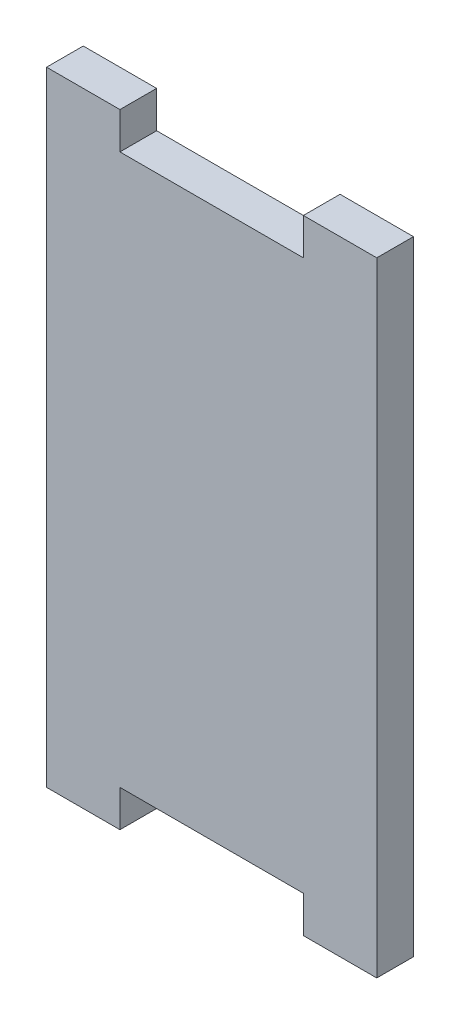
ISO-10303-21;
HEADER;
FILE_DESCRIPTION(('STEP AP214'),'2;1');
FILE_NAME('part.step','',(''),(''),'','','');
FILE_SCHEMA(('AUTOMOTIVE_DESIGN { 1 0 10303 214 1 1 1 1 }'));
ENDSEC;
DATA;
#1=APPLICATION_CONTEXT('core data for automotive mechanical design processes');
#2=APPLICATION_PROTOCOL_DEFINITION('international standard','automotive_design',2000,#1);
#3=PRODUCT_CONTEXT('',#1,'mechanical');
#4=PRODUCT('Part','Part','',(#3));
#5=PRODUCT_RELATED_PRODUCT_CATEGORY('part','',(#4));
#6=PRODUCT_DEFINITION_FORMATION('','',#4);
#7=PRODUCT_DEFINITION_CONTEXT('part definition',#1,'design');
#8=PRODUCT_DEFINITION('design','',#6,#7);
#9=PRODUCT_DEFINITION_SHAPE('','',#8);
#10=(LENGTH_UNIT() NAMED_UNIT(*) SI_UNIT(.MILLI.,.METRE.));
#11=(NAMED_UNIT(*) PLANE_ANGLE_UNIT() SI_UNIT($,.RADIAN.));
#12=(NAMED_UNIT(*) SI_UNIT($,.STERADIAN.) SOLID_ANGLE_UNIT());
#13=UNCERTAINTY_MEASURE_WITH_UNIT(LENGTH_MEASURE(1.E-05),#10,'distance_accuracy_value','');
#14=(GEOMETRIC_REPRESENTATION_CONTEXT(3) GLOBAL_UNCERTAINTY_ASSIGNED_CONTEXT((#13)) GLOBAL_UNIT_ASSIGNED_CONTEXT((#10,
#11,#12)) REPRESENTATION_CONTEXT('',''));
#15=CARTESIAN_POINT('',(0.,0.,0.));
#16=DIRECTION('',(0.,0.,1.));
#17=DIRECTION('',(1.,0.,0.));
#18=AXIS2_PLACEMENT_3D('',#15,#16,#17);
#19=CARTESIAN_POINT('',(0.,0.,5.));
#20=DIRECTION('',(0.,1.,0.));
#21=DIRECTION('',(0.,0.,1.));
#22=AXIS2_PLACEMENT_3D('',#19,#20,#21);
#23=PLANE('',#22);
#24=DIRECTION('',(1.,0.,0.));
#25=VECTOR('',#24,1.);
#26=CARTESIAN_POINT('',(0.,0.,0.));
#27=LINE('',#26,#25);
#28=CARTESIAN_POINT('',(9.99999999999999,0.,0.));
#29=VERTEX_POINT('',#28);
#30=CARTESIAN_POINT('',(35.,0.,0.));
#31=VERTEX_POINT('',#30);
#32=EDGE_CURVE('E55',#29,#31,#27,.T.);
#33=ORIENTED_EDGE('',*,*,#32,.T.);
#34=DIRECTION('',(0.,0.,1.));
#35=VECTOR('',#34,1.);
#36=CARTESIAN_POINT('',(35.,0.,0.));
#37=LINE('',#36,#35);
#38=CARTESIAN_POINT('',(35.,0.,5.));
#39=VERTEX_POINT('',#38);
#40=EDGE_CURVE('E50',#31,#39,#37,.T.);
#41=ORIENTED_EDGE('',*,*,#40,.T.);
#42=DIRECTION('',(1.,0.,0.));
#43=VECTOR('',#42,1.);
#44=CARTESIAN_POINT('',(0.,0.,5.));
#45=LINE('',#44,#43);
#46=CARTESIAN_POINT('',(10.,0.,5.));
#47=VERTEX_POINT('',#46);
#48=EDGE_CURVE('E168',#47,#39,#45,.T.);
#49=ORIENTED_EDGE('',*,*,#48,.F.);
#50=DIRECTION('',(0.,0.,1.));
#51=VECTOR('',#50,1.);
#52=CARTESIAN_POINT('',(10.,0.,0.));
#53=LINE('',#52,#51);
#54=EDGE_CURVE('E163',#29,#47,#53,.T.);
#55=ORIENTED_EDGE('',*,*,#54,.F.);
#56=EDGE_LOOP('',(#33,#41,#49,#55));
#57=FACE_BOUND('',#56,.T.);
#58=ADVANCED_FACE('F33',(#57),#23,.F.);
#59=CARTESIAN_POINT('',(0.,0.,5.));
#60=DIRECTION('',(1.,0.,0.));
#61=DIRECTION('',(0.,0.,-1.));
#62=AXIS2_PLACEMENT_3D('',#59,#60,#61);
#63=PLANE('',#62);
#64=DIRECTION('',(0.,-1.,0.));
#65=VECTOR('',#64,1.);
#66=CARTESIAN_POINT('',(0.,0.,0.));
#67=LINE('',#66,#65);
#68=CARTESIAN_POINT('',(0.,80.,0.));
#69=VERTEX_POINT('',#68);
#70=CARTESIAN_POINT('',(0.,-5.00000000000002,0.));
#71=VERTEX_POINT('',#70);
#72=EDGE_CURVE('E214',#69,#71,#67,.T.);
#73=ORIENTED_EDGE('',*,*,#72,.T.);
#74=DIRECTION('',(0.,0.,1.));
#75=VECTOR('',#74,1.);
#76=CARTESIAN_POINT('',(0.,-5.00000000000002,0.));
#77=LINE('',#76,#75);
#78=CARTESIAN_POINT('',(0.,-5.00000000000002,5.));
#79=VERTEX_POINT('',#78);
#80=EDGE_CURVE('E175',#71,#79,#77,.T.);
#81=ORIENTED_EDGE('',*,*,#80,.T.);
#82=DIRECTION('',(0.,-1.,0.));
#83=VECTOR('',#82,1.);
#84=CARTESIAN_POINT('',(0.,0.,5.));
#85=LINE('',#84,#83);
#86=CARTESIAN_POINT('',(0.,80.,5.));
#87=VERTEX_POINT('',#86);
#88=EDGE_CURVE('E219',#87,#79,#85,.T.);
#89=ORIENTED_EDGE('',*,*,#88,.F.);
#90=DIRECTION('',(0.,0.,1.));
#91=VECTOR('',#90,1.);
#92=CARTESIAN_POINT('',(0.,80.,0.));
#93=LINE('',#92,#91);
#94=EDGE_CURVE('E211',#69,#87,#93,.T.);
#95=ORIENTED_EDGE('',*,*,#94,.F.);
#96=EDGE_LOOP('',(#73,#81,#89,#95));
#97=FACE_BOUND('',#96,.T.);
#98=ADVANCED_FACE('F35',(#97),#63,.F.);
#99=CARTESIAN_POINT('',(45.,0.,5.));
#100=DIRECTION('',(-1.,0.,0.));
#101=DIRECTION('',(0.,0.,1.));
#102=AXIS2_PLACEMENT_3D('',#99,#100,#101);
#103=PLANE('',#102);
#104=DIRECTION('',(0.,1.,0.));
#105=VECTOR('',#104,1.);
#106=CARTESIAN_POINT('',(45.,0.,0.));
#107=LINE('',#106,#105);
#108=CARTESIAN_POINT('',(45.,-5.,0.));
#109=VERTEX_POINT('',#108);
#110=CARTESIAN_POINT('',(45.,80.,0.));
#111=VERTEX_POINT('',#110);
#112=EDGE_CURVE('E141',#109,#111,#107,.T.);
#113=ORIENTED_EDGE('',*,*,#112,.T.);
#114=DIRECTION('',(0.,0.,1.));
#115=VECTOR('',#114,1.);
#116=CARTESIAN_POINT('',(45.,80.,0.));
#117=LINE('',#116,#115);
#118=CARTESIAN_POINT('',(45.,80.,5.));
#119=VERTEX_POINT('',#118);
#120=EDGE_CURVE('E190',#111,#119,#117,.T.);
#121=ORIENTED_EDGE('',*,*,#120,.T.);
#122=DIRECTION('',(0.,1.,0.));
#123=VECTOR('',#122,1.);
#124=CARTESIAN_POINT('',(45.,0.,5.));
#125=LINE('',#124,#123);
#126=CARTESIAN_POINT('',(45.,-5.,5.));
#127=VERTEX_POINT('',#126);
#128=EDGE_CURVE('E42',#127,#119,#125,.T.);
#129=ORIENTED_EDGE('',*,*,#128,.F.);
#130=DIRECTION('',(0.,0.,1.));
#131=VECTOR('',#130,1.);
#132=CARTESIAN_POINT('',(45.,-5.,0.));
#133=LINE('',#132,#131);
#134=EDGE_CURVE('E132',#109,#127,#133,.T.);
#135=ORIENTED_EDGE('',*,*,#134,.F.);
#136=EDGE_LOOP('',(#113,#121,#129,#135));
#137=FACE_BOUND('',#136,.T.);
#138=ADVANCED_FACE('F254',(#137),#103,.F.);
#139=CARTESIAN_POINT('',(0.,75.,5.));
#140=DIRECTION('',(0.,-1.,0.));
#141=DIRECTION('',(0.,0.,-1.));
#142=AXIS2_PLACEMENT_3D('',#139,#140,#141);
#143=PLANE('',#142);
#144=DIRECTION('',(-1.,0.,0.));
#145=VECTOR('',#144,1.);
#146=CARTESIAN_POINT('',(0.,75.,5.));
#147=LINE('',#146,#145);
#148=CARTESIAN_POINT('',(35.,75.,5.));
#149=VERTEX_POINT('',#148);
#150=CARTESIAN_POINT('',(9.99999999999999,75.,5.));
#151=VERTEX_POINT('',#150);
#152=EDGE_CURVE('E11',#149,#151,#147,.T.);
#153=ORIENTED_EDGE('',*,*,#152,.F.);
#154=DIRECTION('',(0.,0.,1.));
#155=VECTOR('',#154,1.);
#156=CARTESIAN_POINT('',(35.,75.,0.));
#157=LINE('',#156,#155);
#158=CARTESIAN_POINT('',(35.,75.,0.));
#159=VERTEX_POINT('',#158);
#160=EDGE_CURVE('E195',#159,#149,#157,.T.);
#161=ORIENTED_EDGE('',*,*,#160,.F.);
#162=DIRECTION('',(-1.,0.,0.));
#163=VECTOR('',#162,1.);
#164=CARTESIAN_POINT('',(0.,75.,0.));
#165=LINE('',#164,#163);
#166=CARTESIAN_POINT('',(10.,75.,0.));
#167=VERTEX_POINT('',#166);
#168=EDGE_CURVE('E230',#159,#167,#165,.T.);
#169=ORIENTED_EDGE('',*,*,#168,.T.);
#170=DIRECTION('',(0.,0.,1.));
#171=VECTOR('',#170,1.);
#172=CARTESIAN_POINT('',(10.,75.,0.));
#173=LINE('',#172,#171);
#174=EDGE_CURVE('E206',#167,#151,#173,.T.);
#175=ORIENTED_EDGE('',*,*,#174,.T.);
#176=EDGE_LOOP('',(#153,#161,#169,#175));
#177=FACE_BOUND('',#176,.T.);
#178=ADVANCED_FACE('F265',(#177),#143,.F.);
#179=CARTESIAN_POINT('',(0.,0.,5.));
#180=DIRECTION('',(0.,0.,-1.));
#181=DIRECTION('',(-1.,0.,0.));
#182=AXIS2_PLACEMENT_3D('',#179,#180,#181);
#183=PLANE('',#182);
#184=ORIENTED_EDGE('',*,*,#88,.T.);
#185=DIRECTION('',(1.,0.,0.));
#186=VECTOR('',#185,1.);
#187=CARTESIAN_POINT('',(0.,-5.00000000000002,5.));
#188=LINE('',#187,#186);
#189=CARTESIAN_POINT('',(10.,-5.00000000000002,5.));
#190=VERTEX_POINT('',#189);
#191=EDGE_CURVE('E149',#79,#190,#188,.T.);
#192=ORIENTED_EDGE('',*,*,#191,.T.);
#193=DIRECTION('',(0.,1.,0.));
#194=VECTOR('',#193,1.);
#195=CARTESIAN_POINT('',(10.,0.,5.));
#196=LINE('',#195,#194);
#197=EDGE_CURVE('E155',#190,#47,#196,.T.);
#198=ORIENTED_EDGE('',*,*,#197,.T.);
#199=ORIENTED_EDGE('',*,*,#48,.T.);
#200=DIRECTION('',(0.,-1.,0.));
#201=VECTOR('',#200,1.);
#202=CARTESIAN_POINT('',(35.,0.,5.));
#203=LINE('',#202,#201);
#204=CARTESIAN_POINT('',(35.,-5.,5.));
#205=VERTEX_POINT('',#204);
#206=EDGE_CURVE('E146',#39,#205,#203,.T.);
#207=ORIENTED_EDGE('',*,*,#206,.T.);
#208=DIRECTION('',(1.,0.,0.));
#209=VECTOR('',#208,1.);
#210=CARTESIAN_POINT('',(45.,-5.,5.));
#211=LINE('',#210,#209);
#212=EDGE_CURVE('E128',#205,#127,#211,.T.);
#213=ORIENTED_EDGE('',*,*,#212,.T.);
#214=ORIENTED_EDGE('',*,*,#128,.T.);
#215=DIRECTION('',(-1.,0.,0.));
#216=VECTOR('',#215,1.);
#217=CARTESIAN_POINT('',(45.,80.,5.));
#218=LINE('',#217,#216);
#219=CARTESIAN_POINT('',(35.,80.,5.));
#220=VERTEX_POINT('',#219);
#221=EDGE_CURVE('E167',#119,#220,#218,.T.);
#222=ORIENTED_EDGE('',*,*,#221,.T.);
#223=DIRECTION('',(0.,-1.,0.));
#224=VECTOR('',#223,1.);
#225=CARTESIAN_POINT('',(35.,75.,5.));
#226=LINE('',#225,#224);
#227=EDGE_CURVE('E187',#220,#149,#226,.T.);
#228=ORIENTED_EDGE('',*,*,#227,.T.);
#229=ORIENTED_EDGE('',*,*,#152,.T.);
#230=DIRECTION('',(0.,1.,0.));
#231=VECTOR('',#230,1.);
#232=CARTESIAN_POINT('',(10.,75.,5.));
#233=LINE('',#232,#231);
#234=CARTESIAN_POINT('',(10.,80.,5.));
#235=VERTEX_POINT('',#234);
#236=EDGE_CURVE('E198',#151,#235,#233,.T.);
#237=ORIENTED_EDGE('',*,*,#236,.T.);
#238=DIRECTION('',(-1.,0.,0.));
#239=VECTOR('',#238,1.);
#240=CARTESIAN_POINT('',(0.,80.,5.));
#241=LINE('',#240,#239);
#242=EDGE_CURVE('E208',#235,#87,#241,.T.);
#243=ORIENTED_EDGE('',*,*,#242,.T.);
#244=EDGE_LOOP('',(#184,#192,#198,#199,#207,#213,#214,#222,#228,#229,#237,#243));
#245=FACE_BOUND('',#244,.T.);
#246=ADVANCED_FACE('F240',(#245),#183,.F.);
#247=CARTESIAN_POINT('',(0.,0.,0.));
#248=DIRECTION('',(0.,0.,-1.));
#249=DIRECTION('',(-1.,0.,0.));
#250=AXIS2_PLACEMENT_3D('',#247,#248,#249);
#251=PLANE('',#250);
#252=ORIENTED_EDGE('',*,*,#72,.F.);
#253=DIRECTION('',(-1.,0.,0.));
#254=VECTOR('',#253,1.);
#255=CARTESIAN_POINT('',(0.,80.,0.));
#256=LINE('',#255,#254);
#257=CARTESIAN_POINT('',(10.,80.,0.));
#258=VERTEX_POINT('',#257);
#259=EDGE_CURVE('E203',#258,#69,#256,.T.);
#260=ORIENTED_EDGE('',*,*,#259,.F.);
#261=DIRECTION('',(0.,1.,0.));
#262=VECTOR('',#261,1.);
#263=CARTESIAN_POINT('',(10.,75.,0.));
#264=LINE('',#263,#262);
#265=EDGE_CURVE('E207',#167,#258,#264,.T.);
#266=ORIENTED_EDGE('',*,*,#265,.F.);
#267=ORIENTED_EDGE('',*,*,#168,.F.);
#268=DIRECTION('',(0.,-1.,0.));
#269=VECTOR('',#268,1.);
#270=CARTESIAN_POINT('',(35.,75.,0.));
#271=LINE('',#270,#269);
#272=CARTESIAN_POINT('',(35.,80.,0.));
#273=VERTEX_POINT('',#272);
#274=EDGE_CURVE('E186',#273,#159,#271,.T.);
#275=ORIENTED_EDGE('',*,*,#274,.F.);
#276=DIRECTION('',(-1.,0.,0.));
#277=VECTOR('',#276,1.);
#278=CARTESIAN_POINT('',(45.,80.,0.));
#279=LINE('',#278,#277);
#280=EDGE_CURVE('E183',#111,#273,#279,.T.);
#281=ORIENTED_EDGE('',*,*,#280,.F.);
#282=ORIENTED_EDGE('',*,*,#112,.F.);
#283=DIRECTION('',(1.,0.,0.));
#284=VECTOR('',#283,1.);
#285=CARTESIAN_POINT('',(45.,-5.,0.));
#286=LINE('',#285,#284);
#287=CARTESIAN_POINT('',(35.,-5.,0.));
#288=VERTEX_POINT('',#287);
#289=EDGE_CURVE('E126',#288,#109,#286,.T.);
#290=ORIENTED_EDGE('',*,*,#289,.F.);
#291=DIRECTION('',(0.,-1.,0.));
#292=VECTOR('',#291,1.);
#293=CARTESIAN_POINT('',(35.,0.,0.));
#294=LINE('',#293,#292);
#295=EDGE_CURVE('E135',#31,#288,#294,.T.);
#296=ORIENTED_EDGE('',*,*,#295,.F.);
#297=ORIENTED_EDGE('',*,*,#32,.F.);
#298=DIRECTION('',(0.,1.,0.));
#299=VECTOR('',#298,1.);
#300=CARTESIAN_POINT('',(10.,0.,0.));
#301=LINE('',#300,#299);
#302=CARTESIAN_POINT('',(10.,-5.00000000000002,0.));
#303=VERTEX_POINT('',#302);
#304=EDGE_CURVE('E154',#303,#29,#301,.T.);
#305=ORIENTED_EDGE('',*,*,#304,.F.);
#306=DIRECTION('',(1.,0.,0.));
#307=VECTOR('',#306,1.);
#308=CARTESIAN_POINT('',(0.,-5.00000000000002,0.));
#309=LINE('',#308,#307);
#310=EDGE_CURVE('E151',#71,#303,#309,.T.);
#311=ORIENTED_EDGE('',*,*,#310,.F.);
#312=EDGE_LOOP('',(#252,#260,#266,#267,#275,#281,#282,#290,#296,#297,#305,#311));
#313=FACE_BOUND('',#312,.T.);
#314=ADVANCED_FACE('F139',(#313),#251,.T.);
#315=CARTESIAN_POINT('',(0.,80.,0.));
#316=DIRECTION('',(0.,1.,0.));
#317=DIRECTION('',(0.,0.,1.));
#318=AXIS2_PLACEMENT_3D('',#315,#316,#317);
#319=PLANE('',#318);
#320=ORIENTED_EDGE('',*,*,#242,.F.);
#321=DIRECTION('',(0.,0.,1.));
#322=VECTOR('',#321,1.);
#323=CARTESIAN_POINT('',(10.,80.,0.));
#324=LINE('',#323,#322);
#325=EDGE_CURVE('E215',#258,#235,#324,.T.);
#326=ORIENTED_EDGE('',*,*,#325,.F.);
#327=ORIENTED_EDGE('',*,*,#259,.T.);
#328=ORIENTED_EDGE('',*,*,#94,.T.);
#329=EDGE_LOOP('',(#320,#326,#327,#328));
#330=FACE_BOUND('',#329,.T.);
#331=ADVANCED_FACE('F244',(#330),#319,.T.);
#332=CARTESIAN_POINT('',(10.,75.,0.));
#333=DIRECTION('',(1.,0.,0.));
#334=DIRECTION('',(0.,0.,-1.));
#335=AXIS2_PLACEMENT_3D('',#332,#333,#334);
#336=PLANE('',#335);
#337=ORIENTED_EDGE('',*,*,#236,.F.);
#338=ORIENTED_EDGE('',*,*,#174,.F.);
#339=ORIENTED_EDGE('',*,*,#265,.T.);
#340=ORIENTED_EDGE('',*,*,#325,.T.);
#341=EDGE_LOOP('',(#337,#338,#339,#340));
#342=FACE_BOUND('',#341,.T.);
#343=ADVANCED_FACE('F266',(#342),#336,.T.);
#344=CARTESIAN_POINT('',(35.,75.,0.));
#345=DIRECTION('',(-1.,0.,0.));
#346=DIRECTION('',(0.,0.,1.));
#347=AXIS2_PLACEMENT_3D('',#344,#345,#346);
#348=PLANE('',#347);
#349=ORIENTED_EDGE('',*,*,#227,.F.);
#350=DIRECTION('',(0.,0.,1.));
#351=VECTOR('',#350,1.);
#352=CARTESIAN_POINT('',(35.,80.,0.));
#353=LINE('',#352,#351);
#354=EDGE_CURVE('E199',#273,#220,#353,.T.);
#355=ORIENTED_EDGE('',*,*,#354,.F.);
#356=ORIENTED_EDGE('',*,*,#274,.T.);
#357=ORIENTED_EDGE('',*,*,#160,.T.);
#358=EDGE_LOOP('',(#349,#355,#356,#357));
#359=FACE_BOUND('',#358,.T.);
#360=ADVANCED_FACE('F263',(#359),#348,.T.);
#361=CARTESIAN_POINT('',(45.,80.,0.));
#362=DIRECTION('',(0.,1.,0.));
#363=DIRECTION('',(0.,0.,1.));
#364=AXIS2_PLACEMENT_3D('',#361,#362,#363);
#365=PLANE('',#364);
#366=ORIENTED_EDGE('',*,*,#221,.F.);
#367=ORIENTED_EDGE('',*,*,#120,.F.);
#368=ORIENTED_EDGE('',*,*,#280,.T.);
#369=ORIENTED_EDGE('',*,*,#354,.T.);
#370=EDGE_LOOP('',(#366,#367,#368,#369));
#371=FACE_BOUND('',#370,.T.);
#372=ADVANCED_FACE('F257',(#371),#365,.T.);
#373=CARTESIAN_POINT('',(10.,0.,0.));
#374=DIRECTION('',(1.,0.,0.));
#375=DIRECTION('',(0.,0.,-1.));
#376=AXIS2_PLACEMENT_3D('',#373,#374,#375);
#377=PLANE('',#376);
#378=ORIENTED_EDGE('',*,*,#197,.F.);
#379=DIRECTION('',(0.,0.,1.));
#380=VECTOR('',#379,1.);
#381=CARTESIAN_POINT('',(10.,-5.00000000000002,0.));
#382=LINE('',#381,#380);
#383=EDGE_CURVE('E160',#303,#190,#382,.T.);
#384=ORIENTED_EDGE('',*,*,#383,.F.);
#385=ORIENTED_EDGE('',*,*,#304,.T.);
#386=ORIENTED_EDGE('',*,*,#54,.T.);
#387=EDGE_LOOP('',(#378,#384,#385,#386));
#388=FACE_BOUND('',#387,.T.);
#389=ADVANCED_FACE('F271',(#388),#377,.T.);
#390=CARTESIAN_POINT('',(0.,-5.00000000000002,0.));
#391=DIRECTION('',(0.,-1.,0.));
#392=DIRECTION('',(0.,0.,-1.));
#393=AXIS2_PLACEMENT_3D('',#390,#391,#392);
#394=PLANE('',#393);
#395=ORIENTED_EDGE('',*,*,#191,.F.);
#396=ORIENTED_EDGE('',*,*,#80,.F.);
#397=ORIENTED_EDGE('',*,*,#310,.T.);
#398=ORIENTED_EDGE('',*,*,#383,.T.);
#399=EDGE_LOOP('',(#395,#396,#397,#398));
#400=FACE_BOUND('',#399,.T.);
#401=ADVANCED_FACE('F269',(#400),#394,.T.);
#402=CARTESIAN_POINT('',(45.,-5.,0.));
#403=DIRECTION('',(0.,-1.,0.));
#404=DIRECTION('',(1.,0.,0.));
#405=AXIS2_PLACEMENT_3D('',#402,#403,#404);
#406=PLANE('',#405);
#407=ORIENTED_EDGE('',*,*,#212,.F.);
#408=DIRECTION('',(0.,0.,1.));
#409=VECTOR('',#408,1.);
#410=CARTESIAN_POINT('',(35.,-5.,0.));
#411=LINE('',#410,#409);
#412=EDGE_CURVE('E121',#288,#205,#411,.T.);
#413=ORIENTED_EDGE('',*,*,#412,.F.);
#414=ORIENTED_EDGE('',*,*,#289,.T.);
#415=ORIENTED_EDGE('',*,*,#134,.T.);
#416=EDGE_LOOP('',(#407,#413,#414,#415));
#417=FACE_BOUND('',#416,.T.);
#418=ADVANCED_FACE('F123',(#417),#406,.T.);
#419=CARTESIAN_POINT('',(35.,0.,0.));
#420=DIRECTION('',(-1.,0.,0.));
#421=DIRECTION('',(0.,0.,1.));
#422=AXIS2_PLACEMENT_3D('',#419,#420,#421);
#423=PLANE('',#422);
#424=ORIENTED_EDGE('',*,*,#206,.F.);
#425=ORIENTED_EDGE('',*,*,#40,.F.);
#426=ORIENTED_EDGE('',*,*,#295,.T.);
#427=ORIENTED_EDGE('',*,*,#412,.T.);
#428=EDGE_LOOP('',(#424,#425,#426,#427));
#429=FACE_BOUND('',#428,.T.);
#430=ADVANCED_FACE('F136',(#429),#423,.T.);
#431=CLOSED_SHELL('',(#58,#98,#138,#178,#246,#314,#331,#343,#360,#372,#389,#401,#418,#430));
#432=MANIFOLD_SOLID_BREP('B2',#431);
#433=ADVANCED_BREP_SHAPE_REPRESENTATION('',(#18,#432),#14);
#434=SHAPE_DEFINITION_REPRESENTATION(#9,#433);
ENDSEC;
END-ISO-10303-21;
